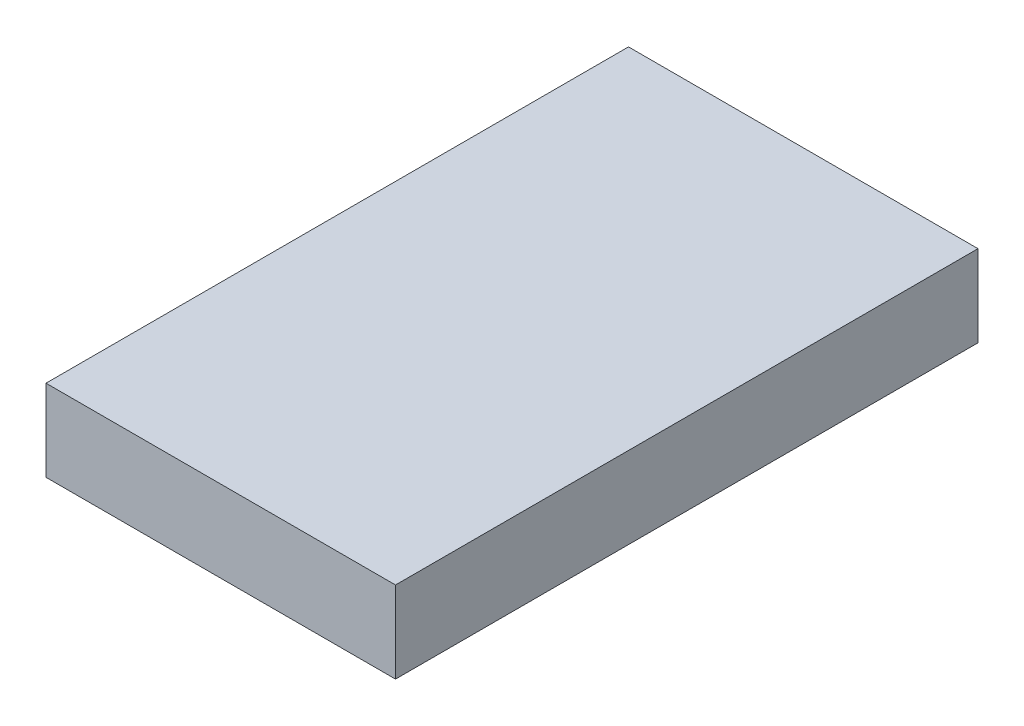
ISO-10303-21;
HEADER;
FILE_DESCRIPTION(('STEP AP214'),'2;1');
FILE_NAME('part.step','',(''),(''),'','','');
FILE_SCHEMA(('AUTOMOTIVE_DESIGN { 1 0 10303 214 1 1 1 1 }'));
ENDSEC;
DATA;
#1=APPLICATION_CONTEXT('core data for automotive mechanical design processes');
#2=APPLICATION_PROTOCOL_DEFINITION('international standard','automotive_design',2000,#1);
#3=PRODUCT_CONTEXT('',#1,'mechanical');
#4=PRODUCT('Part','Part','',(#3));
#5=PRODUCT_RELATED_PRODUCT_CATEGORY('part','',(#4));
#6=PRODUCT_DEFINITION_FORMATION('','',#4);
#7=PRODUCT_DEFINITION_CONTEXT('part definition',#1,'design');
#8=PRODUCT_DEFINITION('design','',#6,#7);
#9=PRODUCT_DEFINITION_SHAPE('','',#8);
#10=(LENGTH_UNIT() NAMED_UNIT(*) SI_UNIT(.MILLI.,.METRE.));
#11=(NAMED_UNIT(*) PLANE_ANGLE_UNIT() SI_UNIT($,.RADIAN.));
#12=(NAMED_UNIT(*) SI_UNIT($,.STERADIAN.) SOLID_ANGLE_UNIT());
#13=UNCERTAINTY_MEASURE_WITH_UNIT(LENGTH_MEASURE(1.E-05),#10,'distance_accuracy_value','');
#14=(GEOMETRIC_REPRESENTATION_CONTEXT(3) GLOBAL_UNCERTAINTY_ASSIGNED_CONTEXT((#13)) GLOBAL_UNIT_ASSIGNED_CONTEXT((#10,
#11,#12)) REPRESENTATION_CONTEXT('',''));
#15=CARTESIAN_POINT('',(0.,0.,0.));
#16=DIRECTION('',(0.,0.,1.));
#17=DIRECTION('',(1.,0.,0.));
#18=AXIS2_PLACEMENT_3D('',#15,#16,#17);
#19=CARTESIAN_POINT('',(7.5,1.75,12.5));
#20=DIRECTION('',(-1.,0.,0.));
#21=DIRECTION('',(0.,0.,1.));
#22=AXIS2_PLACEMENT_3D('',#19,#20,#21);
#23=PLANE('',#22);
#24=DIRECTION('',(0.,0.,-1.));
#25=VECTOR('',#24,1.);
#26=CARTESIAN_POINT('',(7.5,-1.75,12.5));
#27=LINE('',#26,#25);
#28=CARTESIAN_POINT('',(7.5,-1.75,12.5));
#29=VERTEX_POINT('',#28);
#30=CARTESIAN_POINT('',(7.5,-1.75,-12.5));
#31=VERTEX_POINT('',#30);
#32=EDGE_CURVE('E103',#29,#31,#27,.T.);
#33=ORIENTED_EDGE('',*,*,#32,.T.);
#34=DIRECTION('',(0.,-1.,0.));
#35=VECTOR('',#34,1.);
#36=CARTESIAN_POINT('',(7.5,1.75,-12.5));
#37=LINE('',#36,#35);
#38=CARTESIAN_POINT('',(7.5,1.75,-12.5));
#39=VERTEX_POINT('',#38);
#40=EDGE_CURVE('E11',#39,#31,#37,.T.);
#41=ORIENTED_EDGE('',*,*,#40,.F.);
#42=DIRECTION('',(0.,0.,-1.));
#43=VECTOR('',#42,1.);
#44=CARTESIAN_POINT('',(7.5,1.75,12.5));
#45=LINE('',#44,#43);
#46=CARTESIAN_POINT('',(7.5,1.75,12.5));
#47=VERTEX_POINT('',#46);
#48=EDGE_CURVE('E91',#47,#39,#45,.T.);
#49=ORIENTED_EDGE('',*,*,#48,.F.);
#50=DIRECTION('',(0.,-1.,0.));
#51=VECTOR('',#50,1.);
#52=CARTESIAN_POINT('',(7.5,1.75,12.5));
#53=LINE('',#52,#51);
#54=EDGE_CURVE('E99',#47,#29,#53,.T.);
#55=ORIENTED_EDGE('',*,*,#54,.T.);
#56=EDGE_LOOP('',(#33,#41,#49,#55));
#57=FACE_BOUND('',#56,.T.);
#58=ADVANCED_FACE('F40',(#57),#23,.F.);
#59=CARTESIAN_POINT('',(-7.5,1.75,-12.5));
#60=DIRECTION('',(0.,0.,1.));
#61=DIRECTION('',(1.,0.,0.));
#62=AXIS2_PLACEMENT_3D('',#59,#60,#61);
#63=PLANE('',#62);
#64=DIRECTION('',(-1.,0.,0.));
#65=VECTOR('',#64,1.);
#66=CARTESIAN_POINT('',(-7.5,-1.75,-12.5));
#67=LINE('',#66,#65);
#68=CARTESIAN_POINT('',(-7.5,-1.75,-12.5));
#69=VERTEX_POINT('',#68);
#70=EDGE_CURVE('E95',#31,#69,#67,.T.);
#71=ORIENTED_EDGE('',*,*,#70,.T.);
#72=DIRECTION('',(0.,-1.,0.));
#73=VECTOR('',#72,1.);
#74=CARTESIAN_POINT('',(-7.5,1.75,-12.5));
#75=LINE('',#74,#73);
#76=CARTESIAN_POINT('',(-7.5,1.75,-12.5));
#77=VERTEX_POINT('',#76);
#78=EDGE_CURVE('E48',#77,#69,#75,.T.);
#79=ORIENTED_EDGE('',*,*,#78,.F.);
#80=DIRECTION('',(-1.,0.,0.));
#81=VECTOR('',#80,1.);
#82=CARTESIAN_POINT('',(-7.5,1.75,-12.5));
#83=LINE('',#82,#81);
#84=EDGE_CURVE('E86',#39,#77,#83,.T.);
#85=ORIENTED_EDGE('',*,*,#84,.F.);
#86=ORIENTED_EDGE('',*,*,#40,.T.);
#87=EDGE_LOOP('',(#71,#79,#85,#86));
#88=FACE_BOUND('',#87,.T.);
#89=ADVANCED_FACE('F94',(#88),#63,.F.);
#90=CARTESIAN_POINT('',(-7.5,1.75,12.5));
#91=DIRECTION('',(1.,0.,0.));
#92=DIRECTION('',(0.,0.,-1.));
#93=AXIS2_PLACEMENT_3D('',#90,#91,#92);
#94=PLANE('',#93);
#95=DIRECTION('',(0.,0.,1.));
#96=VECTOR('',#95,1.);
#97=CARTESIAN_POINT('',(-7.5,-1.75,12.5));
#98=LINE('',#97,#96);
#99=CARTESIAN_POINT('',(-7.5,-1.75,12.5));
#100=VERTEX_POINT('',#99);
#101=EDGE_CURVE('E73',#69,#100,#98,.T.);
#102=ORIENTED_EDGE('',*,*,#101,.T.);
#103=DIRECTION('',(0.,-1.,0.));
#104=VECTOR('',#103,1.);
#105=CARTESIAN_POINT('',(-7.5,1.75,12.5));
#106=LINE('',#105,#104);
#107=CARTESIAN_POINT('',(-7.5,1.75,12.5));
#108=VERTEX_POINT('',#107);
#109=EDGE_CURVE('E96',#108,#100,#106,.T.);
#110=ORIENTED_EDGE('',*,*,#109,.F.);
#111=DIRECTION('',(0.,0.,1.));
#112=VECTOR('',#111,1.);
#113=CARTESIAN_POINT('',(-7.5,1.75,12.5));
#114=LINE('',#113,#112);
#115=EDGE_CURVE('E89',#77,#108,#114,.T.);
#116=ORIENTED_EDGE('',*,*,#115,.F.);
#117=ORIENTED_EDGE('',*,*,#78,.T.);
#118=EDGE_LOOP('',(#102,#110,#116,#117));
#119=FACE_BOUND('',#118,.T.);
#120=ADVANCED_FACE('F97',(#119),#94,.F.);
#121=CARTESIAN_POINT('',(-7.5,1.75,12.5));
#122=DIRECTION('',(0.,0.,-1.));
#123=DIRECTION('',(-1.,0.,0.));
#124=AXIS2_PLACEMENT_3D('',#121,#122,#123);
#125=PLANE('',#124);
#126=DIRECTION('',(1.,0.,0.));
#127=VECTOR('',#126,1.);
#128=CARTESIAN_POINT('',(-7.5,-1.75,12.5));
#129=LINE('',#128,#127);
#130=EDGE_CURVE('E79',#100,#29,#129,.T.);
#131=ORIENTED_EDGE('',*,*,#130,.T.);
#132=ORIENTED_EDGE('',*,*,#54,.F.);
#133=DIRECTION('',(1.,0.,0.));
#134=VECTOR('',#133,1.);
#135=CARTESIAN_POINT('',(-7.5,1.75,12.5));
#136=LINE('',#135,#134);
#137=EDGE_CURVE('E56',#108,#47,#136,.T.);
#138=ORIENTED_EDGE('',*,*,#137,.F.);
#139=ORIENTED_EDGE('',*,*,#109,.T.);
#140=EDGE_LOOP('',(#131,#132,#138,#139));
#141=FACE_BOUND('',#140,.T.);
#142=ADVANCED_FACE('F110',(#141),#125,.F.);
#143=CARTESIAN_POINT('',(0.,1.75,0.));
#144=DIRECTION('',(0.,-1.,0.));
#145=DIRECTION('',(0.,0.,-1.));
#146=AXIS2_PLACEMENT_3D('',#143,#144,#145);
#147=PLANE('',#146);
#148=ORIENTED_EDGE('',*,*,#48,.T.);
#149=ORIENTED_EDGE('',*,*,#84,.T.);
#150=ORIENTED_EDGE('',*,*,#115,.T.);
#151=ORIENTED_EDGE('',*,*,#137,.T.);
#152=EDGE_LOOP('',(#148,#149,#150,#151));
#153=FACE_BOUND('',#152,.T.);
#154=ADVANCED_FACE('F87',(#153),#147,.F.);
#155=CARTESIAN_POINT('',(0.,-1.75,0.));
#156=DIRECTION('',(0.,-1.,0.));
#157=DIRECTION('',(0.,0.,-1.));
#158=AXIS2_PLACEMENT_3D('',#155,#156,#157);
#159=PLANE('',#158);
#160=ORIENTED_EDGE('',*,*,#32,.F.);
#161=ORIENTED_EDGE('',*,*,#130,.F.);
#162=ORIENTED_EDGE('',*,*,#101,.F.);
#163=ORIENTED_EDGE('',*,*,#70,.F.);
#164=EDGE_LOOP('',(#160,#161,#162,#163));
#165=FACE_BOUND('',#164,.T.);
#166=ADVANCED_FACE('F113',(#165),#159,.T.);
#167=CLOSED_SHELL('',(#58,#89,#120,#142,#154,#166));
#168=MANIFOLD_SOLID_BREP('B2',#167);
#169=ADVANCED_BREP_SHAPE_REPRESENTATION('',(#18,#168),#14);
#170=SHAPE_DEFINITION_REPRESENTATION(#9,#169);
ENDSEC;
END-ISO-10303-21;
